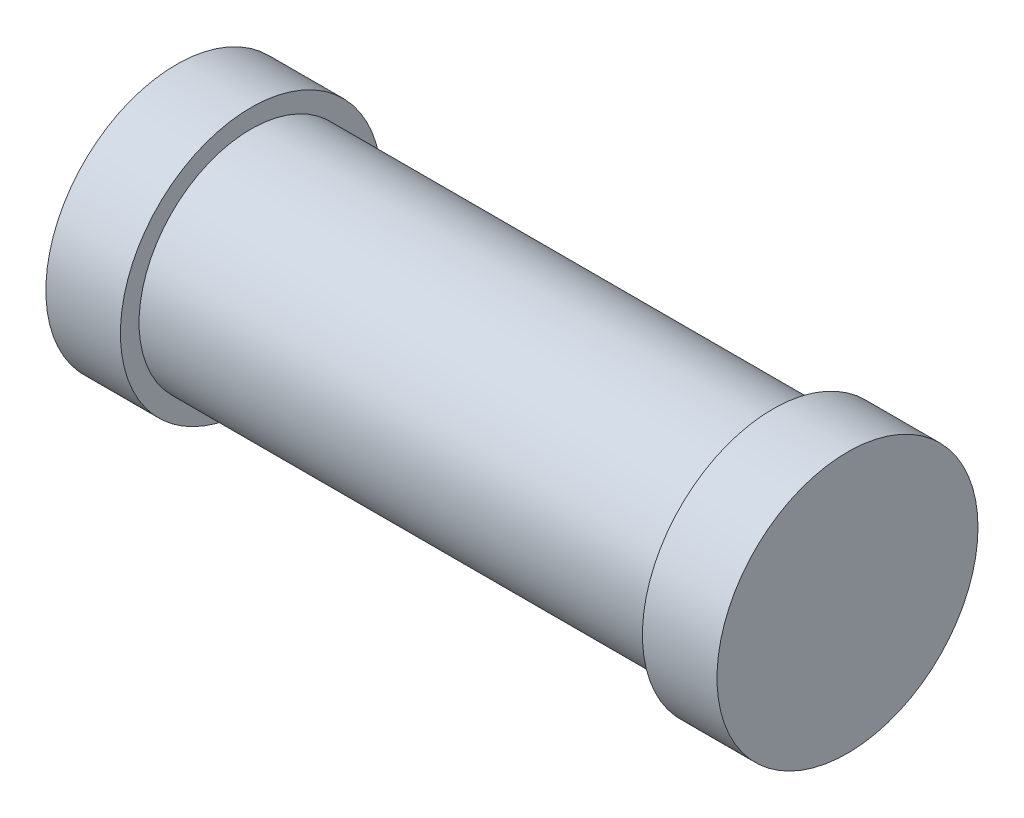
ISO-10303-21;
HEADER;
FILE_DESCRIPTION(('STEP AP214'),'2;1');
FILE_NAME('part.step','',(''),(''),'','','');
FILE_SCHEMA(('AUTOMOTIVE_DESIGN { 1 0 10303 214 1 1 1 1 }'));
ENDSEC;
DATA;
#1=APPLICATION_CONTEXT('core data for automotive mechanical design processes');
#2=APPLICATION_PROTOCOL_DEFINITION('international standard','automotive_design',2000,#1);
#3=PRODUCT_CONTEXT('',#1,'mechanical');
#4=PRODUCT('Part','Part','',(#3));
#5=PRODUCT_RELATED_PRODUCT_CATEGORY('part','',(#4));
#6=PRODUCT_DEFINITION_FORMATION('','',#4);
#7=PRODUCT_DEFINITION_CONTEXT('part definition',#1,'design');
#8=PRODUCT_DEFINITION('design','',#6,#7);
#9=PRODUCT_DEFINITION_SHAPE('','',#8);
#10=(LENGTH_UNIT() NAMED_UNIT(*) SI_UNIT(.MILLI.,.METRE.));
#11=(NAMED_UNIT(*) PLANE_ANGLE_UNIT() SI_UNIT($,.RADIAN.));
#12=(NAMED_UNIT(*) SI_UNIT($,.STERADIAN.) SOLID_ANGLE_UNIT());
#13=UNCERTAINTY_MEASURE_WITH_UNIT(LENGTH_MEASURE(1.E-05),#10,'distance_accuracy_value','');
#14=(GEOMETRIC_REPRESENTATION_CONTEXT(3) GLOBAL_UNCERTAINTY_ASSIGNED_CONTEXT((#13)) GLOBAL_UNIT_ASSIGNED_CONTEXT((#10,
#11,#12)) REPRESENTATION_CONTEXT('',''));
#15=CARTESIAN_POINT('',(0.,0.,0.));
#16=DIRECTION('',(0.,0.,1.));
#17=DIRECTION('',(1.,0.,0.));
#18=AXIS2_PLACEMENT_3D('',#15,#16,#17);
#19=CARTESIAN_POINT('',(-1.8,-0.644394588470459,-0.00100000000000011));
#20=DIRECTION('',(-1.,0.,0.));
#21=DIRECTION('',(0.,0.,1.));
#22=AXIS2_PLACEMENT_3D('',#19,#20,#21);
#23=PLANE('',#22);
#24=CARTESIAN_POINT('',(-1.8,0.0566054115295412,0.7));
#25=DIRECTION('',(1.,0.,0.));
#26=DIRECTION('',(0.,0.,-1.));
#27=AXIS2_PLACEMENT_3D('',#24,#25,#26);
#28=CIRCLE('',#27,0.7);
#29=CARTESIAN_POINT('',(-1.8,0.0566054115295412,0.));
#30=VERTEX_POINT('',#29);
#31=EDGE_CURVE('E18',#30,#30,#28,.T.);
#32=ORIENTED_EDGE('',*,*,#31,.F.);
#33=EDGE_LOOP('',(#32));
#34=FACE_BOUND('',#33,.T.);
#35=ADVANCED_FACE('F14',(#34),#23,.T.);
#36=CARTESIAN_POINT('',(-1.8,0.0566054115295412,0.7));
#37=DIRECTION('',(1.,0.,0.));
#38=DIRECTION('',(0.,0.,-1.));
#39=AXIS2_PLACEMENT_3D('',#36,#37,#38);
#40=CYLINDRICAL_SURFACE('',#39,0.7);
#41=CARTESIAN_POINT('',(-1.4,0.0566054115295412,0.7));
#42=DIRECTION('',(1.,0.,0.));
#43=DIRECTION('',(0.,0.,-1.));
#44=AXIS2_PLACEMENT_3D('',#41,#42,#43);
#45=CIRCLE('',#44,0.7);
#46=CARTESIAN_POINT('',(-1.4,0.0566054115295412,0.));
#47=VERTEX_POINT('',#46);
#48=EDGE_CURVE('E34',#47,#47,#45,.T.);
#49=ORIENTED_EDGE('',*,*,#48,.F.);
#50=EDGE_LOOP('',(#49));
#51=FACE_BOUND('',#50,.T.);
#52=ORIENTED_EDGE('',*,*,#31,.T.);
#53=EDGE_LOOP('',(#52));
#54=FACE_BOUND('',#53,.T.);
#55=ADVANCED_FACE('F41',(#51,#54),#40,.T.);
#56=CARTESIAN_POINT('',(-1.4,-0.644394588470459,1.401));
#57=DIRECTION('',(1.,0.,0.));
#58=DIRECTION('',(0.,0.,-1.));
#59=AXIS2_PLACEMENT_3D('',#56,#57,#58);
#60=PLANE('',#59);
#61=CARTESIAN_POINT('',(-1.4,0.0566054115295412,0.7));
#62=DIRECTION('',(1.,0.,0.));
#63=DIRECTION('',(0.,0.,-1.));
#64=AXIS2_PLACEMENT_3D('',#61,#62,#63);
#65=CIRCLE('',#64,0.6);
#66=CARTESIAN_POINT('',(-1.4,0.0566054115295412,0.0999999999999998));
#67=VERTEX_POINT('',#66);
#68=EDGE_CURVE('E32',#67,#67,#65,.T.);
#69=ORIENTED_EDGE('',*,*,#68,.F.);
#70=EDGE_LOOP('',(#69));
#71=FACE_BOUND('',#70,.T.);
#72=ORIENTED_EDGE('',*,*,#48,.T.);
#73=EDGE_LOOP('',(#72));
#74=FACE_BOUND('',#73,.T.);
#75=ADVANCED_FACE('F49',(#71,#74),#60,.T.);
#76=CARTESIAN_POINT('',(-1.4,0.0566054115295412,0.7));
#77=DIRECTION('',(1.,0.,0.));
#78=DIRECTION('',(0.,0.,-1.));
#79=AXIS2_PLACEMENT_3D('',#76,#77,#78);
#80=CYLINDRICAL_SURFACE('',#79,0.6);
#81=CARTESIAN_POINT('',(1.4,0.0566054115295412,0.7));
#82=DIRECTION('',(1.,0.,0.));
#83=DIRECTION('',(0.,0.,-1.));
#84=AXIS2_PLACEMENT_3D('',#81,#82,#83);
#85=CIRCLE('',#84,0.6);
#86=CARTESIAN_POINT('',(1.4,0.0566054115295412,0.0999999999999998));
#87=VERTEX_POINT('',#86);
#88=EDGE_CURVE('E27',#87,#87,#85,.T.);
#89=ORIENTED_EDGE('',*,*,#88,.F.);
#90=EDGE_LOOP('',(#89));
#91=FACE_BOUND('',#90,.T.);
#92=ORIENTED_EDGE('',*,*,#68,.T.);
#93=EDGE_LOOP('',(#92));
#94=FACE_BOUND('',#93,.T.);
#95=ADVANCED_FACE('F63',(#91,#94),#80,.T.);
#96=CARTESIAN_POINT('',(1.4,-0.644394588470459,-0.00100000000000012));
#97=DIRECTION('',(-1.,0.,0.));
#98=DIRECTION('',(0.,0.,1.));
#99=AXIS2_PLACEMENT_3D('',#96,#97,#98);
#100=PLANE('',#99);
#101=ORIENTED_EDGE('',*,*,#88,.T.);
#102=EDGE_LOOP('',(#101));
#103=FACE_BOUND('',#102,.T.);
#104=CARTESIAN_POINT('',(1.4,0.0566054115295412,0.7));
#105=DIRECTION('',(1.,0.,0.));
#106=DIRECTION('',(0.,0.,-1.));
#107=AXIS2_PLACEMENT_3D('',#104,#105,#106);
#108=CIRCLE('',#107,0.7);
#109=CARTESIAN_POINT('',(1.4,0.0566054115295412,0.));
#110=VERTEX_POINT('',#109);
#111=EDGE_CURVE('E22',#110,#110,#108,.T.);
#112=ORIENTED_EDGE('',*,*,#111,.F.);
#113=EDGE_LOOP('',(#112));
#114=FACE_BOUND('',#113,.T.);
#115=ADVANCED_FACE('F57',(#103,#114),#100,.T.);
#116=CARTESIAN_POINT('',(1.8,-0.644394588470459,1.401));
#117=DIRECTION('',(1.,0.,0.));
#118=DIRECTION('',(0.,0.,-1.));
#119=AXIS2_PLACEMENT_3D('',#116,#117,#118);
#120=PLANE('',#119);
#121=CARTESIAN_POINT('',(1.8,0.0566054115295412,0.7));
#122=DIRECTION('',(1.,0.,0.));
#123=DIRECTION('',(0.,0.,-1.));
#124=AXIS2_PLACEMENT_3D('',#121,#122,#123);
#125=CIRCLE('',#124,0.7);
#126=CARTESIAN_POINT('',(1.8,0.0566054115295412,0.));
#127=VERTEX_POINT('',#126);
#128=EDGE_CURVE('E10',#127,#127,#125,.F.);
#129=ORIENTED_EDGE('',*,*,#128,.F.);
#130=EDGE_LOOP('',(#129));
#131=FACE_BOUND('',#130,.T.);
#132=ADVANCED_FACE('F53',(#131),#120,.T.);
#133=CARTESIAN_POINT('',(1.4,0.0566054115295412,0.7));
#134=DIRECTION('',(1.,0.,0.));
#135=DIRECTION('',(0.,0.,-1.));
#136=AXIS2_PLACEMENT_3D('',#133,#134,#135);
#137=CYLINDRICAL_SURFACE('',#136,0.7);
#138=ORIENTED_EDGE('',*,*,#128,.T.);
#139=EDGE_LOOP('',(#138));
#140=FACE_BOUND('',#139,.T.);
#141=ORIENTED_EDGE('',*,*,#111,.T.);
#142=EDGE_LOOP('',(#141));
#143=FACE_BOUND('',#142,.T.);
#144=ADVANCED_FACE('F16',(#140,#143),#137,.T.);
#145=CLOSED_SHELL('',(#35,#55,#75,#95,#115,#132,#144));
#146=MANIFOLD_SOLID_BREP('B1',#145);
#147=ADVANCED_BREP_SHAPE_REPRESENTATION('',(#18,#146),#14);
#148=SHAPE_DEFINITION_REPRESENTATION(#9,#147);
ENDSEC;
END-ISO-10303-21;
